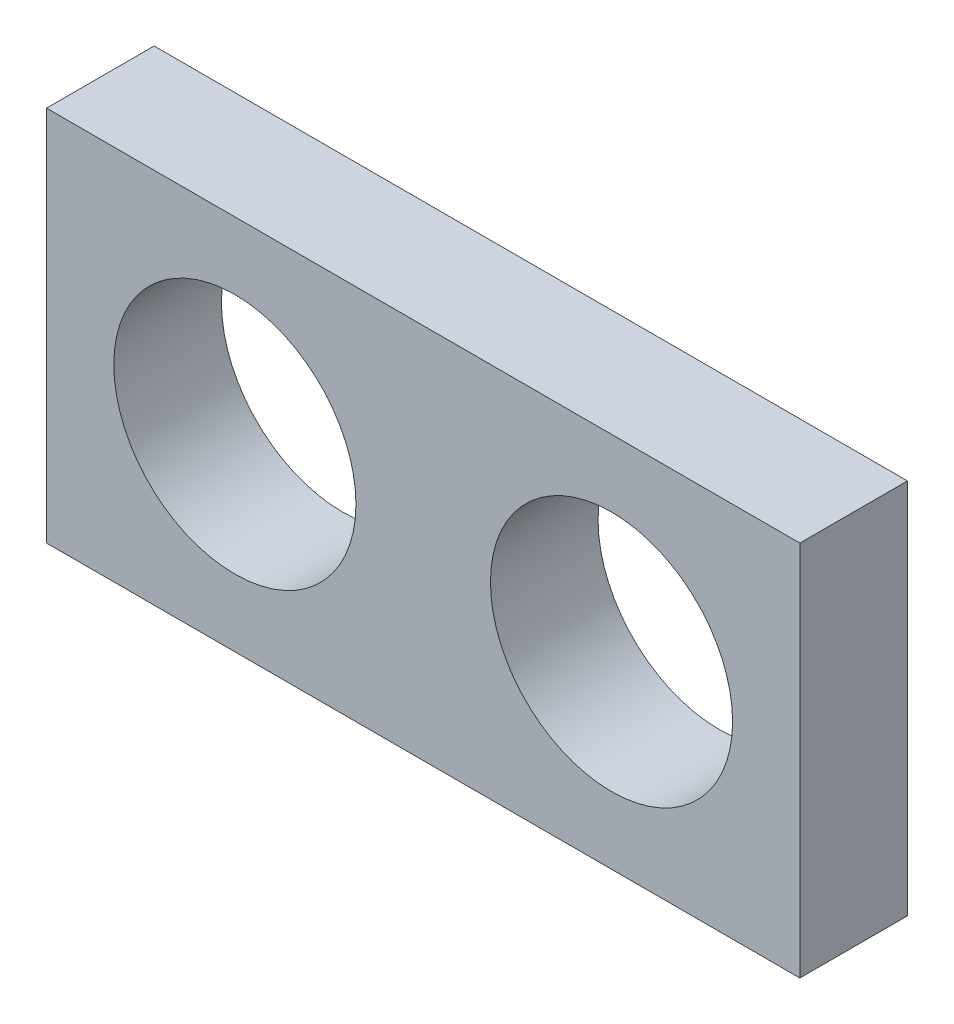
ISO-10303-21;
HEADER;
FILE_DESCRIPTION(('STEP AP214'),'2;1');
FILE_NAME('part.step','',(''),(''),'','','');
FILE_SCHEMA(('AUTOMOTIVE_DESIGN { 1 0 10303 214 1 1 1 1 }'));
ENDSEC;
DATA;
#1=APPLICATION_CONTEXT('core data for automotive mechanical design processes');
#2=APPLICATION_PROTOCOL_DEFINITION('international standard','automotive_design',2000,#1);
#3=PRODUCT_CONTEXT('',#1,'mechanical');
#4=PRODUCT('Part','Part','',(#3));
#5=PRODUCT_RELATED_PRODUCT_CATEGORY('part','',(#4));
#6=PRODUCT_DEFINITION_FORMATION('','',#4);
#7=PRODUCT_DEFINITION_CONTEXT('part definition',#1,'design');
#8=PRODUCT_DEFINITION('design','',#6,#7);
#9=PRODUCT_DEFINITION_SHAPE('','',#8);
#10=(LENGTH_UNIT() NAMED_UNIT(*) SI_UNIT(.MILLI.,.METRE.));
#11=(NAMED_UNIT(*) PLANE_ANGLE_UNIT() SI_UNIT($,.RADIAN.));
#12=(NAMED_UNIT(*) SI_UNIT($,.STERADIAN.) SOLID_ANGLE_UNIT());
#13=UNCERTAINTY_MEASURE_WITH_UNIT(LENGTH_MEASURE(1.E-05),#10,'distance_accuracy_value','');
#14=(GEOMETRIC_REPRESENTATION_CONTEXT(3) GLOBAL_UNCERTAINTY_ASSIGNED_CONTEXT((#13)) GLOBAL_UNIT_ASSIGNED_CONTEXT((#10,
#11,#12)) REPRESENTATION_CONTEXT('',''));
#15=CARTESIAN_POINT('',(0.,0.,0.));
#16=DIRECTION('',(0.,0.,1.));
#17=DIRECTION('',(1.,0.,0.));
#18=AXIS2_PLACEMENT_3D('',#15,#16,#17);
#19=CARTESIAN_POINT('',(0.,0.,2.));
#20=DIRECTION('',(0.,0.,1.));
#21=DIRECTION('',(1.,0.,0.));
#22=AXIS2_PLACEMENT_3D('',#19,#20,#21);
#23=PLANE('',#22);
#24=CARTESIAN_POINT('',(5.25490912256019,0.160284443249691,2.));
#25=DIRECTION('',(0.,0.,1.));
#26=DIRECTION('',(1.,0.,0.));
#27=AXIS2_PLACEMENT_3D('',#24,#25,#26);
#28=CIRCLE('',#27,2.25);
#29=CARTESIAN_POINT('',(7.50490912256019,0.160284443249691,2.));
#30=VERTEX_POINT('',#29);
#31=EDGE_CURVE('E100',#30,#30,#28,.T.);
#32=ORIENTED_EDGE('',*,*,#31,.F.);
#33=EDGE_LOOP('',(#32));
#34=FACE_BOUND('',#33,.T.);
#35=DIRECTION('',(0.,-1.,0.));
#36=VECTOR('',#35,1.);
#37=CARTESIAN_POINT('',(1.75490912256019,3.66028444324969,2.));
#38=LINE('',#37,#36);
#39=CARTESIAN_POINT('',(1.75490912256019,3.66028444324969,2.));
#40=VERTEX_POINT('',#39);
#41=CARTESIAN_POINT('',(1.75490912256019,-3.33971555675031,2.));
#42=VERTEX_POINT('',#41);
#43=EDGE_CURVE('E85',#40,#42,#38,.T.);
#44=ORIENTED_EDGE('',*,*,#43,.T.);
#45=DIRECTION('',(1.,0.,0.));
#46=VECTOR('',#45,1.);
#47=CARTESIAN_POINT('',(1.75490912256019,-3.33971555675031,2.));
#48=LINE('',#47,#46);
#49=CARTESIAN_POINT('',(15.7549091225602,-3.33971555675031,2.));
#50=VERTEX_POINT('',#49);
#51=EDGE_CURVE('E80',#42,#50,#48,.T.);
#52=ORIENTED_EDGE('',*,*,#51,.T.);
#53=DIRECTION('',(0.,1.,0.));
#54=VECTOR('',#53,1.);
#55=CARTESIAN_POINT('',(15.7549091225602,3.66028444324969,2.));
#56=LINE('',#55,#54);
#57=CARTESIAN_POINT('',(15.7549091225602,3.66028444324969,2.));
#58=VERTEX_POINT('',#57);
#59=EDGE_CURVE('E83',#50,#58,#56,.T.);
#60=ORIENTED_EDGE('',*,*,#59,.T.);
#61=DIRECTION('',(-1.,0.,0.));
#62=VECTOR('',#61,1.);
#63=CARTESIAN_POINT('',(1.75490912256019,3.66028444324969,2.));
#64=LINE('',#63,#62);
#65=EDGE_CURVE('E50',#58,#40,#64,.T.);
#66=ORIENTED_EDGE('',*,*,#65,.T.);
#67=EDGE_LOOP('',(#44,#52,#60,#66));
#68=FACE_BOUND('',#67,.T.);
#69=CARTESIAN_POINT('',(12.2549091225602,0.160284443249692,2.));
#70=DIRECTION('',(0.,0.,1.));
#71=DIRECTION('',(1.,0.,0.));
#72=AXIS2_PLACEMENT_3D('',#69,#70,#71);
#73=CIRCLE('',#72,2.25);
#74=CARTESIAN_POINT('',(14.5049091225602,0.160284443249692,2.));
#75=VERTEX_POINT('',#74);
#76=EDGE_CURVE('E115',#75,#75,#73,.T.);
#77=ORIENTED_EDGE('',*,*,#76,.F.);
#78=EDGE_LOOP('',(#77));
#79=FACE_BOUND('',#78,.T.);
#80=ADVANCED_FACE('F33',(#34,#68,#79),#23,.T.);
#81=CARTESIAN_POINT('',(0.,0.,0.));
#82=DIRECTION('',(0.,0.,1.));
#83=DIRECTION('',(1.,0.,0.));
#84=AXIS2_PLACEMENT_3D('',#81,#82,#83);
#85=PLANE('',#84);
#86=DIRECTION('',(0.,-1.,0.));
#87=VECTOR('',#86,1.);
#88=CARTESIAN_POINT('',(1.75490912256019,3.66028444324969,0.));
#89=LINE('',#88,#87);
#90=CARTESIAN_POINT('',(1.75490912256019,3.66028444324969,0.));
#91=VERTEX_POINT('',#90);
#92=CARTESIAN_POINT('',(1.75490912256019,-3.33971555675031,0.));
#93=VERTEX_POINT('',#92);
#94=EDGE_CURVE('E97',#91,#93,#89,.T.);
#95=ORIENTED_EDGE('',*,*,#94,.F.);
#96=DIRECTION('',(-1.,0.,0.));
#97=VECTOR('',#96,1.);
#98=CARTESIAN_POINT('',(1.75490912256019,3.66028444324969,0.));
#99=LINE('',#98,#97);
#100=CARTESIAN_POINT('',(15.7549091225602,3.66028444324969,0.));
#101=VERTEX_POINT('',#100);
#102=EDGE_CURVE('E73',#101,#91,#99,.T.);
#103=ORIENTED_EDGE('',*,*,#102,.F.);
#104=DIRECTION('',(0.,1.,0.));
#105=VECTOR('',#104,1.);
#106=CARTESIAN_POINT('',(15.7549091225602,3.66028444324969,0.));
#107=LINE('',#106,#105);
#108=CARTESIAN_POINT('',(15.7549091225602,-3.33971555675031,0.));
#109=VERTEX_POINT('',#108);
#110=EDGE_CURVE('E67',#109,#101,#107,.T.);
#111=ORIENTED_EDGE('',*,*,#110,.F.);
#112=DIRECTION('',(1.,0.,0.));
#113=VECTOR('',#112,1.);
#114=CARTESIAN_POINT('',(1.75490912256019,-3.33971555675031,0.));
#115=LINE('',#114,#113);
#116=EDGE_CURVE('E89',#93,#109,#115,.T.);
#117=ORIENTED_EDGE('',*,*,#116,.F.);
#118=EDGE_LOOP('',(#95,#103,#111,#117));
#119=FACE_BOUND('',#118,.T.);
#120=CARTESIAN_POINT('',(5.25490912256019,0.160284443249691,0.));
#121=DIRECTION('',(0.,0.,1.));
#122=DIRECTION('',(1.,0.,0.));
#123=AXIS2_PLACEMENT_3D('',#120,#121,#122);
#124=CIRCLE('',#123,2.25);
#125=CARTESIAN_POINT('',(7.50490912256019,0.160284443249691,0.));
#126=VERTEX_POINT('',#125);
#127=EDGE_CURVE('E112',#126,#126,#124,.T.);
#128=ORIENTED_EDGE('',*,*,#127,.T.);
#129=EDGE_LOOP('',(#128));
#130=FACE_BOUND('',#129,.T.);
#131=CARTESIAN_POINT('',(12.2549091225602,0.160284443249692,0.));
#132=DIRECTION('',(0.,0.,1.));
#133=DIRECTION('',(1.,0.,0.));
#134=AXIS2_PLACEMENT_3D('',#131,#132,#133);
#135=CIRCLE('',#134,2.25);
#136=CARTESIAN_POINT('',(14.5049091225602,0.160284443249692,0.));
#137=VERTEX_POINT('',#136);
#138=EDGE_CURVE('E118',#137,#137,#135,.T.);
#139=ORIENTED_EDGE('',*,*,#138,.T.);
#140=EDGE_LOOP('',(#139));
#141=FACE_BOUND('',#140,.T.);
#142=ADVANCED_FACE('F108',(#119,#130,#141),#85,.F.);
#143=CARTESIAN_POINT('',(1.75490912256019,3.66028444324969,2.));
#144=DIRECTION('',(1.,0.,0.));
#145=DIRECTION('',(0.,1.,0.));
#146=AXIS2_PLACEMENT_3D('',#143,#144,#145);
#147=PLANE('',#146);
#148=ORIENTED_EDGE('',*,*,#94,.T.);
#149=DIRECTION('',(0.,0.,-1.));
#150=VECTOR('',#149,1.);
#151=CARTESIAN_POINT('',(1.75490912256019,-3.33971555675031,2.));
#152=LINE('',#151,#150);
#153=EDGE_CURVE('E11',#42,#93,#152,.T.);
#154=ORIENTED_EDGE('',*,*,#153,.F.);
#155=ORIENTED_EDGE('',*,*,#43,.F.);
#156=DIRECTION('',(0.,0.,-1.));
#157=VECTOR('',#156,1.);
#158=CARTESIAN_POINT('',(1.75490912256019,3.66028444324969,2.));
#159=LINE('',#158,#157);
#160=EDGE_CURVE('E93',#40,#91,#159,.T.);
#161=ORIENTED_EDGE('',*,*,#160,.T.);
#162=EDGE_LOOP('',(#148,#154,#155,#161));
#163=FACE_BOUND('',#162,.T.);
#164=ADVANCED_FACE('F35',(#163),#147,.F.);
#165=CARTESIAN_POINT('',(1.75490912256019,-3.33971555675031,2.));
#166=DIRECTION('',(0.,1.,0.));
#167=DIRECTION('',(-1.,0.,0.));
#168=AXIS2_PLACEMENT_3D('',#165,#166,#167);
#169=PLANE('',#168);
#170=ORIENTED_EDGE('',*,*,#116,.T.);
#171=DIRECTION('',(0.,0.,-1.));
#172=VECTOR('',#171,1.);
#173=CARTESIAN_POINT('',(15.7549091225602,-3.33971555675031,2.));
#174=LINE('',#173,#172);
#175=EDGE_CURVE('E42',#50,#109,#174,.T.);
#176=ORIENTED_EDGE('',*,*,#175,.F.);
#177=ORIENTED_EDGE('',*,*,#51,.F.);
#178=ORIENTED_EDGE('',*,*,#153,.T.);
#179=EDGE_LOOP('',(#170,#176,#177,#178));
#180=FACE_BOUND('',#179,.T.);
#181=ADVANCED_FACE('F88',(#180),#169,.F.);
#182=CARTESIAN_POINT('',(15.7549091225602,3.66028444324969,2.));
#183=DIRECTION('',(-1.,0.,0.));
#184=DIRECTION('',(0.,0.,1.));
#185=AXIS2_PLACEMENT_3D('',#182,#183,#184);
#186=PLANE('',#185);
#187=ORIENTED_EDGE('',*,*,#110,.T.);
#188=DIRECTION('',(0.,0.,-1.));
#189=VECTOR('',#188,1.);
#190=CARTESIAN_POINT('',(15.7549091225602,3.66028444324969,2.));
#191=LINE('',#190,#189);
#192=EDGE_CURVE('E90',#58,#101,#191,.T.);
#193=ORIENTED_EDGE('',*,*,#192,.F.);
#194=ORIENTED_EDGE('',*,*,#59,.F.);
#195=ORIENTED_EDGE('',*,*,#175,.T.);
#196=EDGE_LOOP('',(#187,#193,#194,#195));
#197=FACE_BOUND('',#196,.T.);
#198=ADVANCED_FACE('F91',(#197),#186,.F.);
#199=CARTESIAN_POINT('',(1.75490912256019,3.66028444324969,2.));
#200=DIRECTION('',(0.,-1.,0.));
#201=DIRECTION('',(1.,0.,0.));
#202=AXIS2_PLACEMENT_3D('',#199,#200,#201);
#203=PLANE('',#202);
#204=ORIENTED_EDGE('',*,*,#102,.T.);
#205=ORIENTED_EDGE('',*,*,#160,.F.);
#206=ORIENTED_EDGE('',*,*,#65,.F.);
#207=ORIENTED_EDGE('',*,*,#192,.T.);
#208=EDGE_LOOP('',(#204,#205,#206,#207));
#209=FACE_BOUND('',#208,.T.);
#210=ADVANCED_FACE('F105',(#209),#203,.F.);
#211=CARTESIAN_POINT('',(5.25490912256019,0.160284443249691,2.));
#212=DIRECTION('',(0.,0.,-1.));
#213=DIRECTION('',(-1.,0.,0.));
#214=AXIS2_PLACEMENT_3D('',#211,#212,#213);
#215=CYLINDRICAL_SURFACE('',#214,2.25);
#216=ORIENTED_EDGE('',*,*,#31,.T.);
#217=EDGE_LOOP('',(#216));
#218=FACE_BOUND('',#217,.T.);
#219=ORIENTED_EDGE('',*,*,#127,.F.);
#220=EDGE_LOOP('',(#219));
#221=FACE_BOUND('',#220,.T.);
#222=ADVANCED_FACE('F135',(#218,#221),#215,.F.);
#223=CARTESIAN_POINT('',(12.2549091225602,0.160284443249692,2.));
#224=DIRECTION('',(0.,0.,-1.));
#225=DIRECTION('',(-1.,0.,0.));
#226=AXIS2_PLACEMENT_3D('',#223,#224,#225);
#227=CYLINDRICAL_SURFACE('',#226,2.25);
#228=ORIENTED_EDGE('',*,*,#76,.T.);
#229=EDGE_LOOP('',(#228));
#230=FACE_BOUND('',#229,.T.);
#231=ORIENTED_EDGE('',*,*,#138,.F.);
#232=EDGE_LOOP('',(#231));
#233=FACE_BOUND('',#232,.T.);
#234=ADVANCED_FACE('F124',(#230,#233),#227,.F.);
#235=CLOSED_SHELL('',(#80,#142,#164,#181,#198,#210,#222,#234));
#236=MANIFOLD_SOLID_BREP('B2',#235);
#237=ADVANCED_BREP_SHAPE_REPRESENTATION('',(#18,#236),#14);
#238=SHAPE_DEFINITION_REPRESENTATION(#9,#237);
ENDSEC;
END-ISO-10303-21;
